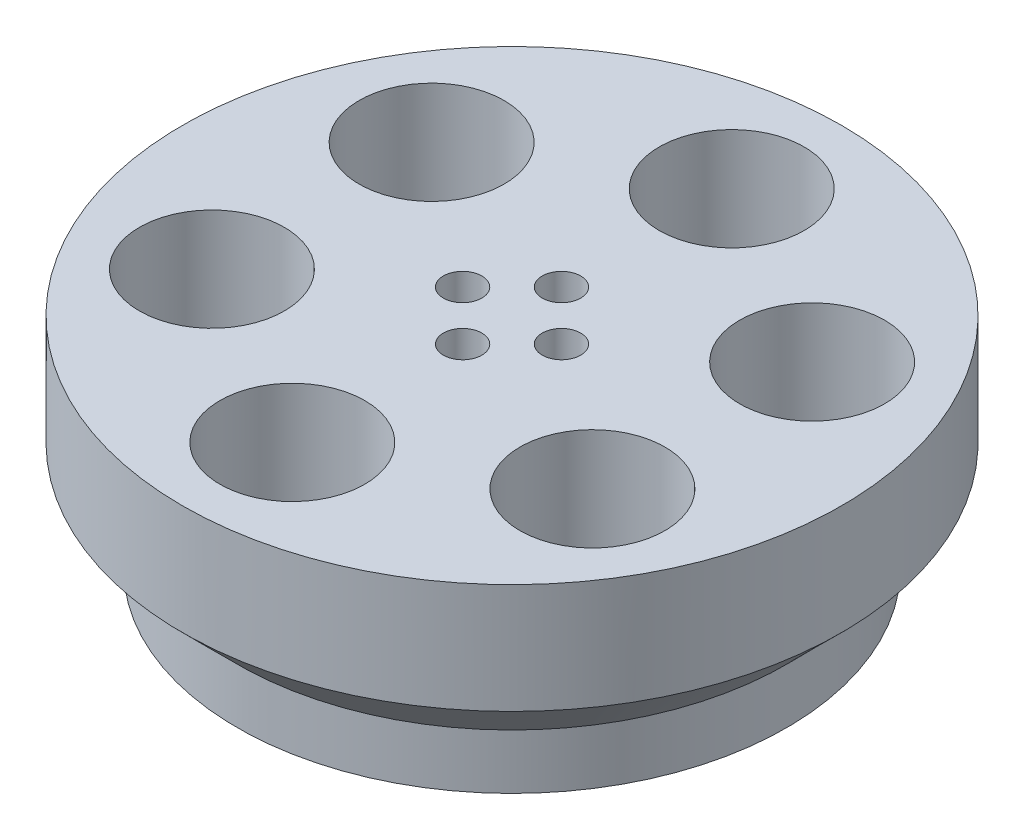
ISO-10303-21;
HEADER;
FILE_DESCRIPTION(('STEP AP214'),'2;1');
FILE_NAME('part.step','',(''),(''),'','','');
FILE_SCHEMA(('AUTOMOTIVE_DESIGN { 1 0 10303 214 1 1 1 1 }'));
ENDSEC;
DATA;
#1=APPLICATION_CONTEXT('core data for automotive mechanical design processes');
#2=APPLICATION_PROTOCOL_DEFINITION('international standard','automotive_design',2000,#1);
#3=PRODUCT_CONTEXT('',#1,'mechanical');
#4=PRODUCT('Part','Part','',(#3));
#5=PRODUCT_RELATED_PRODUCT_CATEGORY('part','',(#4));
#6=PRODUCT_DEFINITION_FORMATION('','',#4);
#7=PRODUCT_DEFINITION_CONTEXT('part definition',#1,'design');
#8=PRODUCT_DEFINITION('design','',#6,#7);
#9=PRODUCT_DEFINITION_SHAPE('','',#8);
#10=(LENGTH_UNIT() NAMED_UNIT(*) SI_UNIT(.MILLI.,.METRE.));
#11=(NAMED_UNIT(*) PLANE_ANGLE_UNIT() SI_UNIT($,.RADIAN.));
#12=(NAMED_UNIT(*) SI_UNIT($,.STERADIAN.) SOLID_ANGLE_UNIT());
#13=UNCERTAINTY_MEASURE_WITH_UNIT(LENGTH_MEASURE(1.E-05),#10,'distance_accuracy_value','');
#14=(GEOMETRIC_REPRESENTATION_CONTEXT(3) GLOBAL_UNCERTAINTY_ASSIGNED_CONTEXT((#13)) GLOBAL_UNIT_ASSIGNED_CONTEXT((#10,
#11,#12)) REPRESENTATION_CONTEXT('',''));
#15=CARTESIAN_POINT('',(0.,0.,0.));
#16=DIRECTION('',(0.,0.,1.));
#17=DIRECTION('',(1.,0.,0.));
#18=AXIS2_PLACEMENT_3D('',#15,#16,#17);
#19=CARTESIAN_POINT('',(0.,20.,0.));
#20=DIRECTION('',(0.,-1.,0.));
#21=DIRECTION('',(0.,0.,-1.));
#22=AXIS2_PLACEMENT_3D('',#19,#20,#21);
#23=CYLINDRICAL_SURFACE('',#22,30.);
#24=CARTESIAN_POINT('',(0.,20.,0.));
#25=DIRECTION('',(0.,1.,0.));
#26=DIRECTION('',(0.,0.,1.));
#27=AXIS2_PLACEMENT_3D('',#24,#25,#26);
#28=CIRCLE('',#27,30.);
#29=CARTESIAN_POINT('',(0.,20.,30.));
#30=VERTEX_POINT('',#29);
#31=EDGE_CURVE('E10',#30,#30,#28,.T.);
#32=ORIENTED_EDGE('',*,*,#31,.F.);
#33=EDGE_LOOP('',(#32));
#34=FACE_BOUND('',#33,.T.);
#35=CARTESIAN_POINT('',(0.,10.,0.));
#36=DIRECTION('',(0.,-1.,0.));
#37=DIRECTION('',(0.,0.,-1.));
#38=AXIS2_PLACEMENT_3D('',#35,#36,#37);
#39=CIRCLE('',#38,30.);
#40=CARTESIAN_POINT('',(0.,10.,-30.));
#41=VERTEX_POINT('',#40);
#42=EDGE_CURVE('E166',#41,#41,#39,.T.);
#43=ORIENTED_EDGE('',*,*,#42,.F.);
#44=EDGE_LOOP('',(#43));
#45=FACE_BOUND('',#44,.T.);
#46=ADVANCED_FACE('F31',(#34,#45),#23,.T.);
#47=CARTESIAN_POINT('',(0.,0.,0.));
#48=DIRECTION('',(0.,1.,0.));
#49=DIRECTION('',(0.,0.,1.));
#50=AXIS2_PLACEMENT_3D('',#47,#48,#49);
#51=PLANE('',#50);
#52=CARTESIAN_POINT('',(0.,0.,-20.));
#53=DIRECTION('',(0.,1.,0.));
#54=DIRECTION('',(0.,0.,1.));
#55=AXIS2_PLACEMENT_3D('',#52,#53,#54);
#56=CIRCLE('',#55,2.);
#57=CARTESIAN_POINT('',(0.,0.,-18.));
#58=VERTEX_POINT('',#57);
#59=EDGE_CURVE('E135',#58,#58,#56,.T.);
#60=ORIENTED_EDGE('',*,*,#59,.T.);
#61=EDGE_LOOP('',(#60));
#62=FACE_BOUND('',#61,.T.);
#63=CARTESIAN_POINT('',(-17.3205080756888,0.,-9.99999999999996));
#64=DIRECTION('',(0.,1.,0.));
#65=DIRECTION('',(0.,0.,1.));
#66=AXIS2_PLACEMENT_3D('',#63,#64,#65);
#67=CIRCLE('',#66,2.);
#68=CARTESIAN_POINT('',(-17.3205080756888,0.,-7.99999999999996));
#69=VERTEX_POINT('',#68);
#70=EDGE_CURVE('E99',#69,#69,#67,.T.);
#71=ORIENTED_EDGE('',*,*,#70,.T.);
#72=EDGE_LOOP('',(#71));
#73=FACE_BOUND('',#72,.T.);
#74=CARTESIAN_POINT('',(-17.3205080756887,0.,10.0000000000001));
#75=DIRECTION('',(0.,1.,0.));
#76=DIRECTION('',(0.,0.,1.));
#77=AXIS2_PLACEMENT_3D('',#74,#75,#76);
#78=CIRCLE('',#77,2.);
#79=CARTESIAN_POINT('',(-17.3205080756887,0.,12.0000000000001));
#80=VERTEX_POINT('',#79);
#81=EDGE_CURVE('E93',#80,#80,#78,.T.);
#82=ORIENTED_EDGE('',*,*,#81,.T.);
#83=EDGE_LOOP('',(#82));
#84=FACE_BOUND('',#83,.T.);
#85=CARTESIAN_POINT('',(0.,0.,20.));
#86=DIRECTION('',(0.,1.,0.));
#87=DIRECTION('',(0.,0.,1.));
#88=AXIS2_PLACEMENT_3D('',#85,#86,#87);
#89=CIRCLE('',#88,2.);
#90=CARTESIAN_POINT('',(0.,0.,22.));
#91=VERTEX_POINT('',#90);
#92=EDGE_CURVE('E87',#91,#91,#89,.T.);
#93=ORIENTED_EDGE('',*,*,#92,.T.);
#94=EDGE_LOOP('',(#93));
#95=FACE_BOUND('',#94,.T.);
#96=CARTESIAN_POINT('',(17.3205080756889,0.,9.99999999999984));
#97=DIRECTION('',(0.,1.,0.));
#98=DIRECTION('',(0.,0.,1.));
#99=AXIS2_PLACEMENT_3D('',#96,#97,#98);
#100=CIRCLE('',#99,2.);
#101=CARTESIAN_POINT('',(17.3205080756889,0.,11.9999999999998));
#102=VERTEX_POINT('',#101);
#103=EDGE_CURVE('E81',#102,#102,#100,.T.);
#104=ORIENTED_EDGE('',*,*,#103,.T.);
#105=EDGE_LOOP('',(#104));
#106=FACE_BOUND('',#105,.T.);
#107=CARTESIAN_POINT('',(17.3205080756887,0.,-10.0000000000002));
#108=DIRECTION('',(0.,1.,0.));
#109=DIRECTION('',(0.,0.,1.));
#110=AXIS2_PLACEMENT_3D('',#107,#108,#109);
#111=CIRCLE('',#110,2.);
#112=CARTESIAN_POINT('',(17.3205080756887,0.,-8.0000000000002));
#113=VERTEX_POINT('',#112);
#114=EDGE_CURVE('E75',#113,#113,#111,.T.);
#115=ORIENTED_EDGE('',*,*,#114,.T.);
#116=EDGE_LOOP('',(#115));
#117=FACE_BOUND('',#116,.T.);
#118=CARTESIAN_POINT('',(4.5,0.,0.));
#119=DIRECTION('',(0.,1.,0.));
#120=DIRECTION('',(0.,0.,1.));
#121=AXIS2_PLACEMENT_3D('',#118,#119,#120);
#122=CIRCLE('',#121,1.75);
#123=CARTESIAN_POINT('',(4.5,0.,1.75));
#124=VERTEX_POINT('',#123);
#125=EDGE_CURVE('E47',#124,#124,#122,.T.);
#126=ORIENTED_EDGE('',*,*,#125,.T.);
#127=EDGE_LOOP('',(#126));
#128=FACE_BOUND('',#127,.T.);
#129=CARTESIAN_POINT('',(0.,0.,-4.5));
#130=DIRECTION('',(0.,1.,0.));
#131=DIRECTION('',(0.,0.,1.));
#132=AXIS2_PLACEMENT_3D('',#129,#130,#131);
#133=CIRCLE('',#132,1.75);
#134=CARTESIAN_POINT('',(0.,0.,-2.75));
#135=VERTEX_POINT('',#134);
#136=EDGE_CURVE('E52',#135,#135,#133,.T.);
#137=ORIENTED_EDGE('',*,*,#136,.T.);
#138=EDGE_LOOP('',(#137));
#139=FACE_BOUND('',#138,.T.);
#140=CARTESIAN_POINT('',(-4.5,0.,0.));
#141=DIRECTION('',(0.,1.,0.));
#142=DIRECTION('',(0.,0.,1.));
#143=AXIS2_PLACEMENT_3D('',#140,#141,#142);
#144=CIRCLE('',#143,1.75);
#145=CARTESIAN_POINT('',(-4.5,0.,1.75));
#146=VERTEX_POINT('',#145);
#147=EDGE_CURVE('E55',#146,#146,#144,.T.);
#148=ORIENTED_EDGE('',*,*,#147,.T.);
#149=EDGE_LOOP('',(#148));
#150=FACE_BOUND('',#149,.T.);
#151=CARTESIAN_POINT('',(0.,0.,4.5));
#152=DIRECTION('',(0.,1.,0.));
#153=DIRECTION('',(0.,0.,1.));
#154=AXIS2_PLACEMENT_3D('',#151,#152,#153);
#155=CIRCLE('',#154,1.75);
#156=CARTESIAN_POINT('',(0.,0.,6.25));
#157=VERTEX_POINT('',#156);
#158=EDGE_CURVE('E34',#157,#157,#155,.T.);
#159=ORIENTED_EDGE('',*,*,#158,.T.);
#160=EDGE_LOOP('',(#159));
#161=FACE_BOUND('',#160,.T.);
#162=CARTESIAN_POINT('',(0.,0.,0.));
#163=DIRECTION('',(0.,-1.,0.));
#164=DIRECTION('',(0.,0.,-1.));
#165=AXIS2_PLACEMENT_3D('',#162,#163,#164);
#166=CIRCLE('',#165,25.);
#167=CARTESIAN_POINT('',(0.,0.,-25.));
#168=VERTEX_POINT('',#167);
#169=EDGE_CURVE('E171',#168,#168,#166,.T.);
#170=ORIENTED_EDGE('',*,*,#169,.T.);
#171=EDGE_LOOP('',(#170));
#172=FACE_BOUND('',#171,.T.);
#173=ADVANCED_FACE('F146',(#62,#73,#84,#95,#106,#117,#128,#139,#150,#161,#172),#51,.F.);
#174=CARTESIAN_POINT('',(0.,20.,0.));
#175=DIRECTION('',(0.,1.,0.));
#176=DIRECTION('',(0.,0.,1.));
#177=AXIS2_PLACEMENT_3D('',#174,#175,#176);
#178=PLANE('',#177);
#179=CARTESIAN_POINT('',(0.,20.,4.5));
#180=DIRECTION('',(0.,1.,0.));
#181=DIRECTION('',(-1.,0.,0.));
#182=AXIS2_PLACEMENT_3D('',#179,#180,#181);
#183=CIRCLE('',#182,1.75);
#184=CARTESIAN_POINT('',(0.,20.,6.25));
#185=VERTEX_POINT('',#184);
#186=EDGE_CURVE('E67',#185,#185,#183,.T.);
#187=ORIENTED_EDGE('',*,*,#186,.F.);
#188=EDGE_LOOP('',(#187));
#189=FACE_BOUND('',#188,.T.);
#190=CARTESIAN_POINT('',(-4.5,20.,0.));
#191=DIRECTION('',(0.,1.,0.));
#192=DIRECTION('',(0.,0.,-1.));
#193=AXIS2_PLACEMENT_3D('',#190,#191,#192);
#194=CIRCLE('',#193,1.75);
#195=CARTESIAN_POINT('',(-4.5,20.,1.75));
#196=VERTEX_POINT('',#195);
#197=EDGE_CURVE('E57',#196,#196,#194,.T.);
#198=ORIENTED_EDGE('',*,*,#197,.F.);
#199=EDGE_LOOP('',(#198));
#200=FACE_BOUND('',#199,.T.);
#201=CARTESIAN_POINT('',(0.,20.,-4.5));
#202=DIRECTION('',(0.,1.,0.));
#203=DIRECTION('',(1.,0.,0.));
#204=AXIS2_PLACEMENT_3D('',#201,#202,#203);
#205=CIRCLE('',#204,1.75);
#206=CARTESIAN_POINT('',(0.,20.,-2.75));
#207=VERTEX_POINT('',#206);
#208=EDGE_CURVE('E54',#207,#207,#205,.T.);
#209=ORIENTED_EDGE('',*,*,#208,.F.);
#210=EDGE_LOOP('',(#209));
#211=FACE_BOUND('',#210,.T.);
#212=CARTESIAN_POINT('',(4.5,20.,0.));
#213=DIRECTION('',(0.,1.,0.));
#214=DIRECTION('',(0.,0.,1.));
#215=AXIS2_PLACEMENT_3D('',#212,#213,#214);
#216=CIRCLE('',#215,1.75);
#217=CARTESIAN_POINT('',(4.5,20.,1.75));
#218=VERTEX_POINT('',#217);
#219=EDGE_CURVE('E51',#218,#218,#216,.T.);
#220=ORIENTED_EDGE('',*,*,#219,.F.);
#221=EDGE_LOOP('',(#220));
#222=FACE_BOUND('',#221,.T.);
#223=CARTESIAN_POINT('',(17.3205080756887,20.,-10.0000000000002));
#224=DIRECTION('',(0.,1.,0.));
#225=DIRECTION('',(-0.866025403784433,0.,0.50000000000001));
#226=AXIS2_PLACEMENT_3D('',#223,#224,#225);
#227=CIRCLE('',#226,6.6);
#228=CARTESIAN_POINT('',(11.6047404107114,20.,-6.70000000000013));
#229=VERTEX_POINT('',#228);
#230=EDGE_CURVE('E102',#229,#229,#227,.T.);
#231=ORIENTED_EDGE('',*,*,#230,.F.);
#232=EDGE_LOOP('',(#231));
#233=FACE_BOUND('',#232,.T.);
#234=CARTESIAN_POINT('',(17.3205080756889,20.,9.99999999999984));
#235=DIRECTION('',(0.,1.,0.));
#236=DIRECTION('',(-0.866025403784443,0.,-0.499999999999992));
#237=AXIS2_PLACEMENT_3D('',#234,#235,#236);
#238=CIRCLE('',#237,6.6);
#239=CARTESIAN_POINT('',(11.6047404107115,20.,6.69999999999989));
#240=VERTEX_POINT('',#239);
#241=EDGE_CURVE('E106',#240,#240,#238,.T.);
#242=ORIENTED_EDGE('',*,*,#241,.F.);
#243=EDGE_LOOP('',(#242));
#244=FACE_BOUND('',#243,.T.);
#245=CARTESIAN_POINT('',(0.,20.,20.));
#246=DIRECTION('',(0.,1.,0.));
#247=DIRECTION('',(0.,0.,-1.));
#248=AXIS2_PLACEMENT_3D('',#245,#246,#247);
#249=CIRCLE('',#248,6.6);
#250=CARTESIAN_POINT('',(0.,20.,13.4));
#251=VERTEX_POINT('',#250);
#252=EDGE_CURVE('E112',#251,#251,#249,.T.);
#253=ORIENTED_EDGE('',*,*,#252,.F.);
#254=EDGE_LOOP('',(#253));
#255=FACE_BOUND('',#254,.T.);
#256=CARTESIAN_POINT('',(-17.3205080756887,20.,10.0000000000001));
#257=DIRECTION('',(0.,1.,0.));
#258=DIRECTION('',(0.866025403784436,0.,-0.500000000000004));
#259=AXIS2_PLACEMENT_3D('',#256,#257,#258);
#260=CIRCLE('',#259,6.6);
#261=CARTESIAN_POINT('',(-11.6047404107115,20.,6.70000000000005));
#262=VERTEX_POINT('',#261);
#263=EDGE_CURVE('E118',#262,#262,#260,.T.);
#264=ORIENTED_EDGE('',*,*,#263,.F.);
#265=EDGE_LOOP('',(#264));
#266=FACE_BOUND('',#265,.T.);
#267=CARTESIAN_POINT('',(-17.3205080756888,20.,-9.99999999999996));
#268=DIRECTION('',(0.,1.,0.));
#269=DIRECTION('',(0.86602540378444,0.,0.499999999999998));
#270=AXIS2_PLACEMENT_3D('',#267,#268,#269);
#271=CIRCLE('',#270,6.6);
#272=CARTESIAN_POINT('',(-11.6047404107115,20.,-6.69999999999997));
#273=VERTEX_POINT('',#272);
#274=EDGE_CURVE('E124',#273,#273,#271,.T.);
#275=ORIENTED_EDGE('',*,*,#274,.F.);
#276=EDGE_LOOP('',(#275));
#277=FACE_BOUND('',#276,.T.);
#278=CARTESIAN_POINT('',(0.,20.,-20.));
#279=DIRECTION('',(0.,1.,0.));
#280=DIRECTION('',(0.,0.,1.));
#281=AXIS2_PLACEMENT_3D('',#278,#279,#280);
#282=CIRCLE('',#281,6.6);
#283=CARTESIAN_POINT('',(0.,20.,-13.4));
#284=VERTEX_POINT('',#283);
#285=EDGE_CURVE('E43',#284,#284,#282,.T.);
#286=ORIENTED_EDGE('',*,*,#285,.F.);
#287=EDGE_LOOP('',(#286));
#288=FACE_BOUND('',#287,.T.);
#289=ORIENTED_EDGE('',*,*,#31,.T.);
#290=EDGE_LOOP('',(#289));
#291=FACE_BOUND('',#290,.T.);
#292=ADVANCED_FACE('F144',(#189,#200,#211,#222,#233,#244,#255,#266,#277,#288,#291),#178,.T.);
#293=CARTESIAN_POINT('',(0.,10.,-20.));
#294=DIRECTION('',(0.,1.,0.));
#295=DIRECTION('',(0.,0.,1.));
#296=AXIS2_PLACEMENT_3D('',#293,#294,#295);
#297=CYLINDRICAL_SURFACE('',#296,6.6);
#298=CARTESIAN_POINT('',(0.,10.,-20.));
#299=DIRECTION('',(0.,1.,0.));
#300=DIRECTION('',(0.,0.,1.));
#301=AXIS2_PLACEMENT_3D('',#298,#299,#300);
#302=CIRCLE('',#301,6.6);
#303=CARTESIAN_POINT('',(0.,10.,-13.4));
#304=VERTEX_POINT('',#303);
#305=EDGE_CURVE('E38',#304,#304,#302,.T.);
#306=ORIENTED_EDGE('',*,*,#305,.F.);
#307=EDGE_LOOP('',(#306));
#308=FACE_BOUND('',#307,.T.);
#309=ORIENTED_EDGE('',*,*,#285,.T.);
#310=EDGE_LOOP('',(#309));
#311=FACE_BOUND('',#310,.T.);
#312=ADVANCED_FACE('F142',(#308,#311),#297,.F.);
#313=CARTESIAN_POINT('',(0.,10.,-20.));
#314=DIRECTION('',(0.,1.,0.));
#315=DIRECTION('',(0.,0.,1.));
#316=AXIS2_PLACEMENT_3D('',#313,#314,#315);
#317=PLANE('',#316);
#318=CARTESIAN_POINT('',(0.,10.,-20.));
#319=DIRECTION('',(0.,1.,0.));
#320=DIRECTION('',(0.,0.,1.));
#321=AXIS2_PLACEMENT_3D('',#318,#319,#320);
#322=CIRCLE('',#321,2.);
#323=CARTESIAN_POINT('',(0.,10.,-18.));
#324=VERTEX_POINT('',#323);
#325=EDGE_CURVE('E130',#324,#324,#322,.T.);
#326=ORIENTED_EDGE('',*,*,#325,.F.);
#327=EDGE_LOOP('',(#326));
#328=FACE_BOUND('',#327,.T.);
#329=ORIENTED_EDGE('',*,*,#305,.T.);
#330=EDGE_LOOP('',(#329));
#331=FACE_BOUND('',#330,.T.);
#332=ADVANCED_FACE('F152',(#328,#331),#317,.T.);
#333=CARTESIAN_POINT('',(0.,-25.,-20.));
#334=DIRECTION('',(0.,1.,0.));
#335=DIRECTION('',(0.,0.,1.));
#336=AXIS2_PLACEMENT_3D('',#333,#334,#335);
#337=CYLINDRICAL_SURFACE('',#336,2.);
#338=ORIENTED_EDGE('',*,*,#325,.T.);
#339=EDGE_LOOP('',(#338));
#340=FACE_BOUND('',#339,.T.);
#341=ORIENTED_EDGE('',*,*,#59,.F.);
#342=EDGE_LOOP('',(#341));
#343=FACE_BOUND('',#342,.T.);
#344=ADVANCED_FACE('F262',(#340,#343),#337,.F.);
#345=CARTESIAN_POINT('',(-17.3205080756888,10.,-9.99999999999996));
#346=DIRECTION('',(0.,1.,0.));
#347=DIRECTION('',(0.,0.,1.));
#348=AXIS2_PLACEMENT_3D('',#345,#346,#347);
#349=CYLINDRICAL_SURFACE('',#348,6.6);
#350=CARTESIAN_POINT('',(-17.3205080756888,10.,-9.99999999999996));
#351=DIRECTION('',(0.,1.,0.));
#352=DIRECTION('',(0.86602540378444,0.,0.499999999999998));
#353=AXIS2_PLACEMENT_3D('',#350,#351,#352);
#354=CIRCLE('',#353,6.6);
#355=CARTESIAN_POINT('',(-11.6047404107115,10.,-6.69999999999997));
#356=VERTEX_POINT('',#355);
#357=EDGE_CURVE('E127',#356,#356,#354,.T.);
#358=ORIENTED_EDGE('',*,*,#357,.F.);
#359=EDGE_LOOP('',(#358));
#360=FACE_BOUND('',#359,.T.);
#361=ORIENTED_EDGE('',*,*,#274,.T.);
#362=EDGE_LOOP('',(#361));
#363=FACE_BOUND('',#362,.T.);
#364=ADVANCED_FACE('F258',(#360,#363),#349,.F.);
#365=CARTESIAN_POINT('',(-17.3205080756888,10.,-9.99999999999996));
#366=DIRECTION('',(0.,1.,0.));
#367=DIRECTION('',(0.86602540378444,0.,0.499999999999998));
#368=AXIS2_PLACEMENT_3D('',#365,#366,#367);
#369=PLANE('',#368);
#370=CARTESIAN_POINT('',(-17.3205080756888,10.,-9.99999999999996));
#371=DIRECTION('',(0.,1.,0.));
#372=DIRECTION('',(0.86602540378444,0.,0.499999999999998));
#373=AXIS2_PLACEMENT_3D('',#370,#371,#372);
#374=CIRCLE('',#373,2.);
#375=CARTESIAN_POINT('',(-15.5884572681199,10.,-8.99999999999996));
#376=VERTEX_POINT('',#375);
#377=EDGE_CURVE('E96',#376,#376,#374,.T.);
#378=ORIENTED_EDGE('',*,*,#377,.F.);
#379=EDGE_LOOP('',(#378));
#380=FACE_BOUND('',#379,.T.);
#381=ORIENTED_EDGE('',*,*,#357,.T.);
#382=EDGE_LOOP('',(#381));
#383=FACE_BOUND('',#382,.T.);
#384=ADVANCED_FACE('F254',(#380,#383),#369,.T.);
#385=CARTESIAN_POINT('',(-17.3205080756887,10.,10.0000000000001));
#386=DIRECTION('',(0.,1.,0.));
#387=DIRECTION('',(0.,0.,1.));
#388=AXIS2_PLACEMENT_3D('',#385,#386,#387);
#389=CYLINDRICAL_SURFACE('',#388,6.6);
#390=CARTESIAN_POINT('',(-17.3205080756887,10.,10.0000000000001));
#391=DIRECTION('',(0.,1.,0.));
#392=DIRECTION('',(0.866025403784436,0.,-0.500000000000004));
#393=AXIS2_PLACEMENT_3D('',#390,#391,#392);
#394=CIRCLE('',#393,6.6);
#395=CARTESIAN_POINT('',(-11.6047404107115,10.,6.70000000000005));
#396=VERTEX_POINT('',#395);
#397=EDGE_CURVE('E121',#396,#396,#394,.T.);
#398=ORIENTED_EDGE('',*,*,#397,.F.);
#399=EDGE_LOOP('',(#398));
#400=FACE_BOUND('',#399,.T.);
#401=ORIENTED_EDGE('',*,*,#263,.T.);
#402=EDGE_LOOP('',(#401));
#403=FACE_BOUND('',#402,.T.);
#404=ADVANCED_FACE('F250',(#400,#403),#389,.F.);
#405=CARTESIAN_POINT('',(-17.3205080756887,10.,10.0000000000001));
#406=DIRECTION('',(0.,1.,0.));
#407=DIRECTION('',(0.866025403784436,0.,-0.500000000000004));
#408=AXIS2_PLACEMENT_3D('',#405,#406,#407);
#409=PLANE('',#408);
#410=CARTESIAN_POINT('',(-17.3205080756887,10.,10.0000000000001));
#411=DIRECTION('',(0.,1.,0.));
#412=DIRECTION('',(0.866025403784436,0.,-0.500000000000004));
#413=AXIS2_PLACEMENT_3D('',#410,#411,#412);
#414=CIRCLE('',#413,2.);
#415=CARTESIAN_POINT('',(-15.5884572681199,10.,9.00000000000007));
#416=VERTEX_POINT('',#415);
#417=EDGE_CURVE('E90',#416,#416,#414,.T.);
#418=ORIENTED_EDGE('',*,*,#417,.F.);
#419=EDGE_LOOP('',(#418));
#420=FACE_BOUND('',#419,.T.);
#421=ORIENTED_EDGE('',*,*,#397,.T.);
#422=EDGE_LOOP('',(#421));
#423=FACE_BOUND('',#422,.T.);
#424=ADVANCED_FACE('F246',(#420,#423),#409,.T.);
#425=CARTESIAN_POINT('',(0.,10.,20.));
#426=DIRECTION('',(0.,1.,0.));
#427=DIRECTION('',(0.,0.,1.));
#428=AXIS2_PLACEMENT_3D('',#425,#426,#427);
#429=CYLINDRICAL_SURFACE('',#428,6.6);
#430=CARTESIAN_POINT('',(0.,10.,20.));
#431=DIRECTION('',(0.,1.,0.));
#432=DIRECTION('',(0.,0.,-1.));
#433=AXIS2_PLACEMENT_3D('',#430,#431,#432);
#434=CIRCLE('',#433,6.6);
#435=CARTESIAN_POINT('',(0.,10.,13.4));
#436=VERTEX_POINT('',#435);
#437=EDGE_CURVE('E115',#436,#436,#434,.T.);
#438=ORIENTED_EDGE('',*,*,#437,.F.);
#439=EDGE_LOOP('',(#438));
#440=FACE_BOUND('',#439,.T.);
#441=ORIENTED_EDGE('',*,*,#252,.T.);
#442=EDGE_LOOP('',(#441));
#443=FACE_BOUND('',#442,.T.);
#444=ADVANCED_FACE('F242',(#440,#443),#429,.F.);
#445=CARTESIAN_POINT('',(0.,10.,20.));
#446=DIRECTION('',(0.,1.,0.));
#447=DIRECTION('',(0.,0.,-1.));
#448=AXIS2_PLACEMENT_3D('',#445,#446,#447);
#449=PLANE('',#448);
#450=CARTESIAN_POINT('',(0.,10.,20.));
#451=DIRECTION('',(0.,1.,0.));
#452=DIRECTION('',(0.,0.,-1.));
#453=AXIS2_PLACEMENT_3D('',#450,#451,#452);
#454=CIRCLE('',#453,2.);
#455=CARTESIAN_POINT('',(0.,10.,18.));
#456=VERTEX_POINT('',#455);
#457=EDGE_CURVE('E84',#456,#456,#454,.T.);
#458=ORIENTED_EDGE('',*,*,#457,.F.);
#459=EDGE_LOOP('',(#458));
#460=FACE_BOUND('',#459,.T.);
#461=ORIENTED_EDGE('',*,*,#437,.T.);
#462=EDGE_LOOP('',(#461));
#463=FACE_BOUND('',#462,.T.);
#464=ADVANCED_FACE('F238',(#460,#463),#449,.T.);
#465=CARTESIAN_POINT('',(17.3205080756889,10.,9.99999999999984));
#466=DIRECTION('',(0.,1.,0.));
#467=DIRECTION('',(0.,0.,1.));
#468=AXIS2_PLACEMENT_3D('',#465,#466,#467);
#469=CYLINDRICAL_SURFACE('',#468,6.6);
#470=CARTESIAN_POINT('',(17.3205080756889,10.,9.99999999999984));
#471=DIRECTION('',(0.,1.,0.));
#472=DIRECTION('',(-0.866025403784443,0.,-0.499999999999992));
#473=AXIS2_PLACEMENT_3D('',#470,#471,#472);
#474=CIRCLE('',#473,6.6);
#475=CARTESIAN_POINT('',(11.6047404107115,10.,6.69999999999989));
#476=VERTEX_POINT('',#475);
#477=EDGE_CURVE('E109',#476,#476,#474,.T.);
#478=ORIENTED_EDGE('',*,*,#477,.F.);
#479=EDGE_LOOP('',(#478));
#480=FACE_BOUND('',#479,.T.);
#481=ORIENTED_EDGE('',*,*,#241,.T.);
#482=EDGE_LOOP('',(#481));
#483=FACE_BOUND('',#482,.T.);
#484=ADVANCED_FACE('F234',(#480,#483),#469,.F.);
#485=CARTESIAN_POINT('',(17.3205080756889,10.,9.99999999999984));
#486=DIRECTION('',(0.,1.,0.));
#487=DIRECTION('',(-0.866025403784443,0.,-0.499999999999992));
#488=AXIS2_PLACEMENT_3D('',#485,#486,#487);
#489=PLANE('',#488);
#490=CARTESIAN_POINT('',(17.3205080756889,10.,9.99999999999984));
#491=DIRECTION('',(0.,1.,0.));
#492=DIRECTION('',(-0.866025403784443,0.,-0.499999999999992));
#493=AXIS2_PLACEMENT_3D('',#490,#491,#492);
#494=CIRCLE('',#493,2.);
#495=CARTESIAN_POINT('',(15.58845726812,10.,8.99999999999985));
#496=VERTEX_POINT('',#495);
#497=EDGE_CURVE('E78',#496,#496,#494,.T.);
#498=ORIENTED_EDGE('',*,*,#497,.F.);
#499=EDGE_LOOP('',(#498));
#500=FACE_BOUND('',#499,.T.);
#501=ORIENTED_EDGE('',*,*,#477,.T.);
#502=EDGE_LOOP('',(#501));
#503=FACE_BOUND('',#502,.T.);
#504=ADVANCED_FACE('F230',(#500,#503),#489,.T.);
#505=CARTESIAN_POINT('',(17.3205080756887,10.,-10.0000000000002));
#506=DIRECTION('',(0.,1.,0.));
#507=DIRECTION('',(0.,0.,1.));
#508=AXIS2_PLACEMENT_3D('',#505,#506,#507);
#509=CYLINDRICAL_SURFACE('',#508,6.6);
#510=CARTESIAN_POINT('',(17.3205080756887,10.,-10.0000000000002));
#511=DIRECTION('',(0.,1.,0.));
#512=DIRECTION('',(-0.866025403784433,0.,0.50000000000001));
#513=AXIS2_PLACEMENT_3D('',#510,#511,#512);
#514=CIRCLE('',#513,6.6);
#515=CARTESIAN_POINT('',(11.6047404107114,10.,-6.70000000000013));
#516=VERTEX_POINT('',#515);
#517=EDGE_CURVE('E103',#516,#516,#514,.T.);
#518=ORIENTED_EDGE('',*,*,#517,.F.);
#519=EDGE_LOOP('',(#518));
#520=FACE_BOUND('',#519,.T.);
#521=ORIENTED_EDGE('',*,*,#230,.T.);
#522=EDGE_LOOP('',(#521));
#523=FACE_BOUND('',#522,.T.);
#524=ADVANCED_FACE('F226',(#520,#523),#509,.F.);
#525=CARTESIAN_POINT('',(17.3205080756887,10.,-10.0000000000002));
#526=DIRECTION('',(0.,1.,0.));
#527=DIRECTION('',(-0.866025403784433,0.,0.50000000000001));
#528=AXIS2_PLACEMENT_3D('',#525,#526,#527);
#529=PLANE('',#528);
#530=CARTESIAN_POINT('',(17.3205080756887,10.,-10.0000000000002));
#531=DIRECTION('',(0.,1.,0.));
#532=DIRECTION('',(-0.866025403784433,0.,0.50000000000001));
#533=AXIS2_PLACEMENT_3D('',#530,#531,#532);
#534=CIRCLE('',#533,2.);
#535=CARTESIAN_POINT('',(15.5884572681198,10.,-9.00000000000018));
#536=VERTEX_POINT('',#535);
#537=EDGE_CURVE('E50',#536,#536,#534,.T.);
#538=ORIENTED_EDGE('',*,*,#537,.F.);
#539=EDGE_LOOP('',(#538));
#540=FACE_BOUND('',#539,.T.);
#541=ORIENTED_EDGE('',*,*,#517,.T.);
#542=EDGE_LOOP('',(#541));
#543=FACE_BOUND('',#542,.T.);
#544=ADVANCED_FACE('F222',(#540,#543),#529,.T.);
#545=CARTESIAN_POINT('',(-17.3205080756888,-25.,-9.99999999999996));
#546=DIRECTION('',(0.,1.,0.));
#547=DIRECTION('',(0.,0.,1.));
#548=AXIS2_PLACEMENT_3D('',#545,#546,#547);
#549=CYLINDRICAL_SURFACE('',#548,2.);
#550=ORIENTED_EDGE('',*,*,#377,.T.);
#551=EDGE_LOOP('',(#550));
#552=FACE_BOUND('',#551,.T.);
#553=ORIENTED_EDGE('',*,*,#70,.F.);
#554=EDGE_LOOP('',(#553));
#555=FACE_BOUND('',#554,.T.);
#556=ADVANCED_FACE('F218',(#552,#555),#549,.F.);
#557=CARTESIAN_POINT('',(-17.3205080756887,-25.,10.0000000000001));
#558=DIRECTION('',(0.,1.,0.));
#559=DIRECTION('',(0.,0.,1.));
#560=AXIS2_PLACEMENT_3D('',#557,#558,#559);
#561=CYLINDRICAL_SURFACE('',#560,2.);
#562=ORIENTED_EDGE('',*,*,#417,.T.);
#563=EDGE_LOOP('',(#562));
#564=FACE_BOUND('',#563,.T.);
#565=ORIENTED_EDGE('',*,*,#81,.F.);
#566=EDGE_LOOP('',(#565));
#567=FACE_BOUND('',#566,.T.);
#568=ADVANCED_FACE('F214',(#564,#567),#561,.F.);
#569=CARTESIAN_POINT('',(0.,-25.,20.));
#570=DIRECTION('',(0.,1.,0.));
#571=DIRECTION('',(0.,0.,1.));
#572=AXIS2_PLACEMENT_3D('',#569,#570,#571);
#573=CYLINDRICAL_SURFACE('',#572,2.);
#574=ORIENTED_EDGE('',*,*,#457,.T.);
#575=EDGE_LOOP('',(#574));
#576=FACE_BOUND('',#575,.T.);
#577=ORIENTED_EDGE('',*,*,#92,.F.);
#578=EDGE_LOOP('',(#577));
#579=FACE_BOUND('',#578,.T.);
#580=ADVANCED_FACE('F210',(#576,#579),#573,.F.);
#581=CARTESIAN_POINT('',(17.3205080756889,-25.,9.99999999999984));
#582=DIRECTION('',(0.,1.,0.));
#583=DIRECTION('',(0.,0.,1.));
#584=AXIS2_PLACEMENT_3D('',#581,#582,#583);
#585=CYLINDRICAL_SURFACE('',#584,2.);
#586=ORIENTED_EDGE('',*,*,#497,.T.);
#587=EDGE_LOOP('',(#586));
#588=FACE_BOUND('',#587,.T.);
#589=ORIENTED_EDGE('',*,*,#103,.F.);
#590=EDGE_LOOP('',(#589));
#591=FACE_BOUND('',#590,.T.);
#592=ADVANCED_FACE('F206',(#588,#591),#585,.F.);
#593=CARTESIAN_POINT('',(17.3205080756887,-25.,-10.0000000000002));
#594=DIRECTION('',(0.,1.,0.));
#595=DIRECTION('',(0.,0.,1.));
#596=AXIS2_PLACEMENT_3D('',#593,#594,#595);
#597=CYLINDRICAL_SURFACE('',#596,2.);
#598=ORIENTED_EDGE('',*,*,#537,.T.);
#599=EDGE_LOOP('',(#598));
#600=FACE_BOUND('',#599,.T.);
#601=ORIENTED_EDGE('',*,*,#114,.F.);
#602=EDGE_LOOP('',(#601));
#603=FACE_BOUND('',#602,.T.);
#604=ADVANCED_FACE('F202',(#600,#603),#597,.F.);
#605=CARTESIAN_POINT('',(4.5,-25.,0.));
#606=DIRECTION('',(0.,1.,0.));
#607=DIRECTION('',(0.,0.,1.));
#608=AXIS2_PLACEMENT_3D('',#605,#606,#607);
#609=CYLINDRICAL_SURFACE('',#608,1.75);
#610=CARTESIAN_POINT('',(4.5,20.,1.75));
#611=CARTESIAN_POINT('',(4.5,19.7916666666667,1.75));
#612=CARTESIAN_POINT('',(4.5,19.5833333333333,1.75));
#613=CARTESIAN_POINT('',(4.5,19.1666666666667,1.75));
#614=CARTESIAN_POINT('',(4.5,18.9583333333333,1.75));
#615=CARTESIAN_POINT('',(4.5,18.5416666666667,1.75));
#616=CARTESIAN_POINT('',(4.5,18.3333333333333,1.75));
#617=CARTESIAN_POINT('',(4.5,17.9166666666667,1.75));
#618=CARTESIAN_POINT('',(4.5,17.7083333333333,1.75));
#619=CARTESIAN_POINT('',(4.5,17.2916666666667,1.75));
#620=CARTESIAN_POINT('',(4.5,17.0833333333333,1.75));
#621=CARTESIAN_POINT('',(4.5,16.6666666666667,1.75));
#622=CARTESIAN_POINT('',(4.5,16.4583333333333,1.75));
#623=CARTESIAN_POINT('',(4.5,16.0416666666667,1.75));
#624=CARTESIAN_POINT('',(4.5,15.8333333333333,1.75));
#625=CARTESIAN_POINT('',(4.5,15.4166666666667,1.75));
#626=CARTESIAN_POINT('',(4.5,15.2083333333333,1.75));
#627=CARTESIAN_POINT('',(4.5,14.7916666666667,1.75));
#628=CARTESIAN_POINT('',(4.5,14.5833333333333,1.75));
#629=CARTESIAN_POINT('',(4.5,14.1666666666667,1.75));
#630=CARTESIAN_POINT('',(4.5,13.9583333333333,1.75));
#631=CARTESIAN_POINT('',(4.5,13.5416666666667,1.75));
#632=CARTESIAN_POINT('',(4.5,13.3333333333333,1.75));
#633=CARTESIAN_POINT('',(4.5,12.9166666666667,1.75));
#634=CARTESIAN_POINT('',(4.5,12.7083333333333,1.75));
#635=CARTESIAN_POINT('',(4.5,12.2916666666667,1.75));
#636=CARTESIAN_POINT('',(4.5,12.0833333333333,1.75));
#637=CARTESIAN_POINT('',(4.5,11.6666666666667,1.75));
#638=CARTESIAN_POINT('',(4.5,11.4583333333333,1.75));
#639=CARTESIAN_POINT('',(4.5,11.0416666666667,1.75));
#640=CARTESIAN_POINT('',(4.5,10.8333333333333,1.75));
#641=CARTESIAN_POINT('',(4.5,10.4166666666667,1.75));
#642=CARTESIAN_POINT('',(4.5,10.2083333333333,1.75));
#643=CARTESIAN_POINT('',(4.5,9.79166666666667,1.75));
#644=CARTESIAN_POINT('',(4.5,9.58333333333333,1.75));
#645=CARTESIAN_POINT('',(4.5,9.16666666666666,1.75));
#646=CARTESIAN_POINT('',(4.5,8.95833333333333,1.75));
#647=CARTESIAN_POINT('',(4.5,8.54166666666666,1.75));
#648=CARTESIAN_POINT('',(4.5,8.33333333333333,1.75));
#649=CARTESIAN_POINT('',(4.5,7.91666666666666,1.75));
#650=CARTESIAN_POINT('',(4.5,7.70833333333333,1.75));
#651=CARTESIAN_POINT('',(4.5,7.29166666666666,1.75));
#652=CARTESIAN_POINT('',(4.5,7.08333333333333,1.75));
#653=CARTESIAN_POINT('',(4.5,6.66666666666666,1.75));
#654=CARTESIAN_POINT('',(4.5,6.45833333333333,1.75));
#655=CARTESIAN_POINT('',(4.5,6.04166666666667,1.75));
#656=CARTESIAN_POINT('',(4.5,5.83333333333334,1.75));
#657=CARTESIAN_POINT('',(4.5,5.41666666666667,1.75));
#658=CARTESIAN_POINT('',(4.5,5.20833333333333,1.75));
#659=CARTESIAN_POINT('',(4.5,4.79166666666667,1.75));
#660=CARTESIAN_POINT('',(4.5,4.58333333333333,1.75));
#661=CARTESIAN_POINT('',(4.5,4.16666666666667,1.75));
#662=CARTESIAN_POINT('',(4.5,3.95833333333333,1.75));
#663=CARTESIAN_POINT('',(4.5,3.54166666666667,1.75));
#664=CARTESIAN_POINT('',(4.5,3.33333333333333,1.75));
#665=CARTESIAN_POINT('',(4.5,2.91666666666667,1.75));
#666=CARTESIAN_POINT('',(4.5,2.70833333333333,1.75));
#667=CARTESIAN_POINT('',(4.5,2.29166666666667,1.75));
#668=CARTESIAN_POINT('',(4.5,2.08333333333334,1.75));
#669=CARTESIAN_POINT('',(4.5,1.66666666666667,1.75));
#670=CARTESIAN_POINT('',(4.5,1.45833333333333,1.75));
#671=CARTESIAN_POINT('',(4.5,1.04166666666667,1.75));
#672=CARTESIAN_POINT('',(4.5,0.833333333333334,1.75));
#673=CARTESIAN_POINT('',(4.5,0.416666666666667,1.75));
#674=CARTESIAN_POINT('',(4.5,0.208333333333334,1.75));
#675=CARTESIAN_POINT('',(4.5,0.,1.75));
#676=B_SPLINE_CURVE_WITH_KNOTS('',3,(#610,#611,#612,#613,#614,#615,#616,#617,#618,#619,#620,
#621,#622,#623,#624,#625,#626,#627,#628,#629,#630,#631,#632,#633,#634,#635,#636,#637,#638,#639,
#640,#641,#642,#643,#644,#645,#646,#647,#648,#649,#650,#651,#652,#653,#654,#655,#656,#657,#658,
#659,#660,#661,#662,#663,#664,#665,#666,#667,#668,#669,#670,#671,#672,#673,#674,#675),
.UNSPECIFIED.,.F.,.F.,(4,2,2,2,2,2,2,2,2,2,2,2,2,2,2,2,2,2,2,2,2,2,2,2,2,2,2,2,2,2,2,2,4),(0.,
0.625000000000001,1.25,1.875,2.5,3.125,3.75,4.375,5.,5.62500000000001,6.25,6.875,7.5,8.125,8.75,
9.375,10.,10.625,11.25,11.875,12.5,13.125,13.75,14.375,15.,15.625,16.25,16.875,17.5,18.125,
18.75,19.375,20.),.UNSPECIFIED.);
#677=EDGE_CURVE('BSEAM198',#218,#124,#676,.T.);
#678=ORIENTED_EDGE('',*,*,#219,.T.);
#679=ORIENTED_EDGE('',*,*,#125,.F.);
#680=ORIENTED_EDGE('',*,*,#677,.T.);
#681=ORIENTED_EDGE('',*,*,#677,.F.);
#682=EDGE_LOOP('',(#678,#680,#679,#681));
#683=FACE_BOUND('',#682,.T.);
#684=ADVANCED_FACE('F198',(#683),#609,.F.);
#685=CARTESIAN_POINT('',(0.,-25.,-4.5));
#686=DIRECTION('',(0.,1.,0.));
#687=DIRECTION('',(0.,0.,1.));
#688=AXIS2_PLACEMENT_3D('',#685,#686,#687);
#689=CYLINDRICAL_SURFACE('',#688,1.75);
#690=CARTESIAN_POINT('',(0.,20.,-2.75));
#691=CARTESIAN_POINT('',(0.,19.7916666666667,-2.75));
#692=CARTESIAN_POINT('',(0.,19.5833333333333,-2.75));
#693=CARTESIAN_POINT('',(0.,19.1666666666667,-2.75));
#694=CARTESIAN_POINT('',(0.,18.9583333333333,-2.75));
#695=CARTESIAN_POINT('',(0.,18.5416666666667,-2.75));
#696=CARTESIAN_POINT('',(0.,18.3333333333333,-2.75));
#697=CARTESIAN_POINT('',(0.,17.9166666666667,-2.75));
#698=CARTESIAN_POINT('',(0.,17.7083333333333,-2.75));
#699=CARTESIAN_POINT('',(0.,17.2916666666667,-2.75));
#700=CARTESIAN_POINT('',(0.,17.0833333333333,-2.75));
#701=CARTESIAN_POINT('',(0.,16.6666666666667,-2.75));
#702=CARTESIAN_POINT('',(0.,16.4583333333333,-2.75));
#703=CARTESIAN_POINT('',(0.,16.0416666666667,-2.75));
#704=CARTESIAN_POINT('',(0.,15.8333333333333,-2.75));
#705=CARTESIAN_POINT('',(0.,15.4166666666667,-2.75));
#706=CARTESIAN_POINT('',(0.,15.2083333333333,-2.75));
#707=CARTESIAN_POINT('',(0.,14.7916666666667,-2.75));
#708=CARTESIAN_POINT('',(0.,14.5833333333333,-2.75));
#709=CARTESIAN_POINT('',(0.,14.1666666666667,-2.75));
#710=CARTESIAN_POINT('',(0.,13.9583333333333,-2.75));
#711=CARTESIAN_POINT('',(0.,13.5416666666667,-2.75));
#712=CARTESIAN_POINT('',(0.,13.3333333333333,-2.75));
#713=CARTESIAN_POINT('',(0.,12.9166666666667,-2.75));
#714=CARTESIAN_POINT('',(0.,12.7083333333333,-2.75));
#715=CARTESIAN_POINT('',(0.,12.2916666666667,-2.75));
#716=CARTESIAN_POINT('',(0.,12.0833333333333,-2.75));
#717=CARTESIAN_POINT('',(0.,11.6666666666667,-2.75));
#718=CARTESIAN_POINT('',(0.,11.4583333333333,-2.75));
#719=CARTESIAN_POINT('',(0.,11.0416666666667,-2.75));
#720=CARTESIAN_POINT('',(0.,10.8333333333333,-2.75));
#721=CARTESIAN_POINT('',(0.,10.4166666666667,-2.75));
#722=CARTESIAN_POINT('',(0.,10.2083333333333,-2.75));
#723=CARTESIAN_POINT('',(0.,9.79166666666667,-2.75));
#724=CARTESIAN_POINT('',(0.,9.58333333333333,-2.75));
#725=CARTESIAN_POINT('',(0.,9.16666666666666,-2.75));
#726=CARTESIAN_POINT('',(0.,8.95833333333333,-2.75));
#727=CARTESIAN_POINT('',(0.,8.54166666666666,-2.75));
#728=CARTESIAN_POINT('',(0.,8.33333333333333,-2.75));
#729=CARTESIAN_POINT('',(0.,7.91666666666666,-2.75));
#730=CARTESIAN_POINT('',(0.,7.70833333333333,-2.75));
#731=CARTESIAN_POINT('',(0.,7.29166666666666,-2.75));
#732=CARTESIAN_POINT('',(0.,7.08333333333333,-2.75));
#733=CARTESIAN_POINT('',(0.,6.66666666666666,-2.75));
#734=CARTESIAN_POINT('',(0.,6.45833333333333,-2.75));
#735=CARTESIAN_POINT('',(0.,6.04166666666667,-2.75));
#736=CARTESIAN_POINT('',(0.,5.83333333333334,-2.75));
#737=CARTESIAN_POINT('',(0.,5.41666666666667,-2.75));
#738=CARTESIAN_POINT('',(0.,5.20833333333333,-2.75));
#739=CARTESIAN_POINT('',(0.,4.79166666666667,-2.75));
#740=CARTESIAN_POINT('',(0.,4.58333333333333,-2.75));
#741=CARTESIAN_POINT('',(0.,4.16666666666667,-2.75));
#742=CARTESIAN_POINT('',(0.,3.95833333333333,-2.75));
#743=CARTESIAN_POINT('',(0.,3.54166666666667,-2.75));
#744=CARTESIAN_POINT('',(0.,3.33333333333333,-2.75));
#745=CARTESIAN_POINT('',(0.,2.91666666666667,-2.75));
#746=CARTESIAN_POINT('',(0.,2.70833333333333,-2.75));
#747=CARTESIAN_POINT('',(0.,2.29166666666667,-2.75));
#748=CARTESIAN_POINT('',(0.,2.08333333333334,-2.75));
#749=CARTESIAN_POINT('',(0.,1.66666666666667,-2.75));
#750=CARTESIAN_POINT('',(0.,1.45833333333333,-2.75));
#751=CARTESIAN_POINT('',(0.,1.04166666666667,-2.75));
#752=CARTESIAN_POINT('',(0.,0.833333333333334,-2.75));
#753=CARTESIAN_POINT('',(0.,0.416666666666667,-2.75));
#754=CARTESIAN_POINT('',(0.,0.208333333333334,-2.75));
#755=CARTESIAN_POINT('',(0.,0.,-2.75));
#756=B_SPLINE_CURVE_WITH_KNOTS('',3,(#690,#691,#692,#693,#694,#695,#696,#697,#698,#699,#700,
#701,#702,#703,#704,#705,#706,#707,#708,#709,#710,#711,#712,#713,#714,#715,#716,#717,#718,#719,
#720,#721,#722,#723,#724,#725,#726,#727,#728,#729,#730,#731,#732,#733,#734,#735,#736,#737,#738,
#739,#740,#741,#742,#743,#744,#745,#746,#747,#748,#749,#750,#751,#752,#753,#754,#755),
.UNSPECIFIED.,.F.,.F.,(4,2,2,2,2,2,2,2,2,2,2,2,2,2,2,2,2,2,2,2,2,2,2,2,2,2,2,2,2,2,2,2,4),(0.,
0.625000000000001,1.25,1.875,2.5,3.125,3.75,4.375,5.,5.62500000000001,6.25,6.875,7.5,8.125,8.75,
9.375,10.,10.625,11.25,11.875,12.5,13.125,13.75,14.375,15.,15.625,16.25,16.875,17.5,18.125,
18.75,19.375,20.),.UNSPECIFIED.);
#757=EDGE_CURVE('BSEAM195',#207,#135,#756,.T.);
#758=ORIENTED_EDGE('',*,*,#208,.T.);
#759=ORIENTED_EDGE('',*,*,#136,.F.);
#760=ORIENTED_EDGE('',*,*,#757,.T.);
#761=ORIENTED_EDGE('',*,*,#757,.F.);
#762=EDGE_LOOP('',(#758,#760,#759,#761));
#763=FACE_BOUND('',#762,.T.);
#764=ADVANCED_FACE('F195',(#763),#689,.F.);
#765=CARTESIAN_POINT('',(-4.5,-25.,0.));
#766=DIRECTION('',(0.,1.,0.));
#767=DIRECTION('',(0.,0.,1.));
#768=AXIS2_PLACEMENT_3D('',#765,#766,#767);
#769=CYLINDRICAL_SURFACE('',#768,1.75);
#770=CARTESIAN_POINT('',(-4.5,20.,1.75));
#771=CARTESIAN_POINT('',(-4.5,19.7916666666667,1.75));
#772=CARTESIAN_POINT('',(-4.5,19.5833333333333,1.75));
#773=CARTESIAN_POINT('',(-4.5,19.1666666666667,1.75));
#774=CARTESIAN_POINT('',(-4.5,18.9583333333333,1.75));
#775=CARTESIAN_POINT('',(-4.5,18.5416666666667,1.75));
#776=CARTESIAN_POINT('',(-4.5,18.3333333333333,1.75));
#777=CARTESIAN_POINT('',(-4.5,17.9166666666667,1.75));
#778=CARTESIAN_POINT('',(-4.5,17.7083333333333,1.75));
#779=CARTESIAN_POINT('',(-4.5,17.2916666666667,1.75));
#780=CARTESIAN_POINT('',(-4.5,17.0833333333333,1.75));
#781=CARTESIAN_POINT('',(-4.5,16.6666666666667,1.75));
#782=CARTESIAN_POINT('',(-4.5,16.4583333333333,1.75));
#783=CARTESIAN_POINT('',(-4.5,16.0416666666667,1.75));
#784=CARTESIAN_POINT('',(-4.5,15.8333333333333,1.75));
#785=CARTESIAN_POINT('',(-4.5,15.4166666666667,1.75));
#786=CARTESIAN_POINT('',(-4.5,15.2083333333333,1.75));
#787=CARTESIAN_POINT('',(-4.5,14.7916666666667,1.75));
#788=CARTESIAN_POINT('',(-4.5,14.5833333333333,1.75));
#789=CARTESIAN_POINT('',(-4.5,14.1666666666667,1.75));
#790=CARTESIAN_POINT('',(-4.5,13.9583333333333,1.75));
#791=CARTESIAN_POINT('',(-4.5,13.5416666666667,1.75));
#792=CARTESIAN_POINT('',(-4.5,13.3333333333333,1.75));
#793=CARTESIAN_POINT('',(-4.5,12.9166666666667,1.75));
#794=CARTESIAN_POINT('',(-4.5,12.7083333333333,1.75));
#795=CARTESIAN_POINT('',(-4.5,12.2916666666667,1.75));
#796=CARTESIAN_POINT('',(-4.5,12.0833333333333,1.75));
#797=CARTESIAN_POINT('',(-4.5,11.6666666666667,1.75));
#798=CARTESIAN_POINT('',(-4.5,11.4583333333333,1.75));
#799=CARTESIAN_POINT('',(-4.5,11.0416666666667,1.75));
#800=CARTESIAN_POINT('',(-4.5,10.8333333333333,1.75));
#801=CARTESIAN_POINT('',(-4.5,10.4166666666667,1.75));
#802=CARTESIAN_POINT('',(-4.5,10.2083333333333,1.75));
#803=CARTESIAN_POINT('',(-4.5,9.79166666666667,1.75));
#804=CARTESIAN_POINT('',(-4.5,9.58333333333333,1.75));
#805=CARTESIAN_POINT('',(-4.5,9.16666666666666,1.75));
#806=CARTESIAN_POINT('',(-4.5,8.95833333333333,1.75));
#807=CARTESIAN_POINT('',(-4.5,8.54166666666666,1.75));
#808=CARTESIAN_POINT('',(-4.5,8.33333333333333,1.75));
#809=CARTESIAN_POINT('',(-4.5,7.91666666666666,1.75));
#810=CARTESIAN_POINT('',(-4.5,7.70833333333333,1.75));
#811=CARTESIAN_POINT('',(-4.5,7.29166666666666,1.75));
#812=CARTESIAN_POINT('',(-4.5,7.08333333333333,1.75));
#813=CARTESIAN_POINT('',(-4.5,6.66666666666666,1.75));
#814=CARTESIAN_POINT('',(-4.5,6.45833333333333,1.75));
#815=CARTESIAN_POINT('',(-4.5,6.04166666666667,1.75));
#816=CARTESIAN_POINT('',(-4.5,5.83333333333334,1.75));
#817=CARTESIAN_POINT('',(-4.5,5.41666666666667,1.75));
#818=CARTESIAN_POINT('',(-4.5,5.20833333333333,1.75));
#819=CARTESIAN_POINT('',(-4.5,4.79166666666667,1.75));
#820=CARTESIAN_POINT('',(-4.5,4.58333333333333,1.75));
#821=CARTESIAN_POINT('',(-4.5,4.16666666666667,1.75));
#822=CARTESIAN_POINT('',(-4.5,3.95833333333333,1.75));
#823=CARTESIAN_POINT('',(-4.5,3.54166666666667,1.75));
#824=CARTESIAN_POINT('',(-4.5,3.33333333333333,1.75));
#825=CARTESIAN_POINT('',(-4.5,2.91666666666667,1.75));
#826=CARTESIAN_POINT('',(-4.5,2.70833333333333,1.75));
#827=CARTESIAN_POINT('',(-4.5,2.29166666666667,1.75));
#828=CARTESIAN_POINT('',(-4.5,2.08333333333334,1.75));
#829=CARTESIAN_POINT('',(-4.5,1.66666666666667,1.75));
#830=CARTESIAN_POINT('',(-4.5,1.45833333333333,1.75));
#831=CARTESIAN_POINT('',(-4.5,1.04166666666667,1.75));
#832=CARTESIAN_POINT('',(-4.5,0.833333333333334,1.75));
#833=CARTESIAN_POINT('',(-4.5,0.416666666666667,1.75));
#834=CARTESIAN_POINT('',(-4.5,0.208333333333334,1.75));
#835=CARTESIAN_POINT('',(-4.5,0.,1.75));
#836=B_SPLINE_CURVE_WITH_KNOTS('',3,(#770,#771,#772,#773,#774,#775,#776,#777,#778,#779,#780,
#781,#782,#783,#784,#785,#786,#787,#788,#789,#790,#791,#792,#793,#794,#795,#796,#797,#798,#799,
#800,#801,#802,#803,#804,#805,#806,#807,#808,#809,#810,#811,#812,#813,#814,#815,#816,#817,#818,
#819,#820,#821,#822,#823,#824,#825,#826,#827,#828,#829,#830,#831,#832,#833,#834,#835),
.UNSPECIFIED.,.F.,.F.,(4,2,2,2,2,2,2,2,2,2,2,2,2,2,2,2,2,2,2,2,2,2,2,2,2,2,2,2,2,2,2,2,4),(0.,
0.625000000000001,1.25,1.875,2.5,3.125,3.75,4.375,5.,5.62500000000001,6.25,6.875,7.5,8.125,8.75,
9.375,10.,10.625,11.25,11.875,12.5,13.125,13.75,14.375,15.,15.625,16.25,16.875,17.5,18.125,
18.75,19.375,20.),.UNSPECIFIED.);
#837=EDGE_CURVE('BSEAM191',#196,#146,#836,.T.);
#838=ORIENTED_EDGE('',*,*,#197,.T.);
#839=ORIENTED_EDGE('',*,*,#147,.F.);
#840=ORIENTED_EDGE('',*,*,#837,.T.);
#841=ORIENTED_EDGE('',*,*,#837,.F.);
#842=EDGE_LOOP('',(#838,#840,#839,#841));
#843=FACE_BOUND('',#842,.T.);
#844=ADVANCED_FACE('F191',(#843),#769,.F.);
#845=CARTESIAN_POINT('',(0.,-25.,4.5));
#846=DIRECTION('',(0.,1.,0.));
#847=DIRECTION('',(0.,0.,1.));
#848=AXIS2_PLACEMENT_3D('',#845,#846,#847);
#849=CYLINDRICAL_SURFACE('',#848,1.75);
#850=CARTESIAN_POINT('',(0.,20.,6.25));
#851=CARTESIAN_POINT('',(0.,19.7916666666667,6.25));
#852=CARTESIAN_POINT('',(0.,19.5833333333333,6.25));
#853=CARTESIAN_POINT('',(0.,19.1666666666667,6.25));
#854=CARTESIAN_POINT('',(0.,18.9583333333333,6.25));
#855=CARTESIAN_POINT('',(0.,18.5416666666667,6.25));
#856=CARTESIAN_POINT('',(0.,18.3333333333333,6.25));
#857=CARTESIAN_POINT('',(0.,17.9166666666667,6.25));
#858=CARTESIAN_POINT('',(0.,17.7083333333333,6.25));
#859=CARTESIAN_POINT('',(0.,17.2916666666667,6.25));
#860=CARTESIAN_POINT('',(0.,17.0833333333333,6.25));
#861=CARTESIAN_POINT('',(0.,16.6666666666667,6.25));
#862=CARTESIAN_POINT('',(0.,16.4583333333333,6.25));
#863=CARTESIAN_POINT('',(0.,16.0416666666667,6.25));
#864=CARTESIAN_POINT('',(0.,15.8333333333333,6.25));
#865=CARTESIAN_POINT('',(0.,15.4166666666667,6.25));
#866=CARTESIAN_POINT('',(0.,15.2083333333333,6.25));
#867=CARTESIAN_POINT('',(0.,14.7916666666667,6.25));
#868=CARTESIAN_POINT('',(0.,14.5833333333333,6.25));
#869=CARTESIAN_POINT('',(0.,14.1666666666667,6.25));
#870=CARTESIAN_POINT('',(0.,13.9583333333333,6.25));
#871=CARTESIAN_POINT('',(0.,13.5416666666667,6.25));
#872=CARTESIAN_POINT('',(0.,13.3333333333333,6.25));
#873=CARTESIAN_POINT('',(0.,12.9166666666667,6.25));
#874=CARTESIAN_POINT('',(0.,12.7083333333333,6.25));
#875=CARTESIAN_POINT('',(0.,12.2916666666667,6.25));
#876=CARTESIAN_POINT('',(0.,12.0833333333333,6.25));
#877=CARTESIAN_POINT('',(0.,11.6666666666667,6.25));
#878=CARTESIAN_POINT('',(0.,11.4583333333333,6.25));
#879=CARTESIAN_POINT('',(0.,11.0416666666667,6.25));
#880=CARTESIAN_POINT('',(0.,10.8333333333333,6.25));
#881=CARTESIAN_POINT('',(0.,10.4166666666667,6.25));
#882=CARTESIAN_POINT('',(0.,10.2083333333333,6.25));
#883=CARTESIAN_POINT('',(0.,9.79166666666667,6.25));
#884=CARTESIAN_POINT('',(0.,9.58333333333333,6.25));
#885=CARTESIAN_POINT('',(0.,9.16666666666666,6.25));
#886=CARTESIAN_POINT('',(0.,8.95833333333333,6.25));
#887=CARTESIAN_POINT('',(0.,8.54166666666666,6.25));
#888=CARTESIAN_POINT('',(0.,8.33333333333333,6.25));
#889=CARTESIAN_POINT('',(0.,7.91666666666666,6.25));
#890=CARTESIAN_POINT('',(0.,7.70833333333333,6.25));
#891=CARTESIAN_POINT('',(0.,7.29166666666666,6.25));
#892=CARTESIAN_POINT('',(0.,7.08333333333333,6.25));
#893=CARTESIAN_POINT('',(0.,6.66666666666666,6.25));
#894=CARTESIAN_POINT('',(0.,6.45833333333333,6.25));
#895=CARTESIAN_POINT('',(0.,6.04166666666667,6.25));
#896=CARTESIAN_POINT('',(0.,5.83333333333334,6.25));
#897=CARTESIAN_POINT('',(0.,5.41666666666667,6.25));
#898=CARTESIAN_POINT('',(0.,5.20833333333333,6.25));
#899=CARTESIAN_POINT('',(0.,4.79166666666667,6.25));
#900=CARTESIAN_POINT('',(0.,4.58333333333333,6.25));
#901=CARTESIAN_POINT('',(0.,4.16666666666667,6.25));
#902=CARTESIAN_POINT('',(0.,3.95833333333333,6.25));
#903=CARTESIAN_POINT('',(0.,3.54166666666667,6.25));
#904=CARTESIAN_POINT('',(0.,3.33333333333333,6.25));
#905=CARTESIAN_POINT('',(0.,2.91666666666667,6.25));
#906=CARTESIAN_POINT('',(0.,2.70833333333333,6.25));
#907=CARTESIAN_POINT('',(0.,2.29166666666667,6.25));
#908=CARTESIAN_POINT('',(0.,2.08333333333334,6.25));
#909=CARTESIAN_POINT('',(0.,1.66666666666667,6.25));
#910=CARTESIAN_POINT('',(0.,1.45833333333333,6.25));
#911=CARTESIAN_POINT('',(0.,1.04166666666667,6.25));
#912=CARTESIAN_POINT('',(0.,0.833333333333334,6.25));
#913=CARTESIAN_POINT('',(0.,0.416666666666667,6.25));
#914=CARTESIAN_POINT('',(0.,0.208333333333334,6.25));
#915=CARTESIAN_POINT('',(0.,0.,6.25));
#916=B_SPLINE_CURVE_WITH_KNOTS('',3,(#850,#851,#852,#853,#854,#855,#856,#857,#858,#859,#860,
#861,#862,#863,#864,#865,#866,#867,#868,#869,#870,#871,#872,#873,#874,#875,#876,#877,#878,#879,
#880,#881,#882,#883,#884,#885,#886,#887,#888,#889,#890,#891,#892,#893,#894,#895,#896,#897,#898,
#899,#900,#901,#902,#903,#904,#905,#906,#907,#908,#909,#910,#911,#912,#913,#914,#915),
.UNSPECIFIED.,.F.,.F.,(4,2,2,2,2,2,2,2,2,2,2,2,2,2,2,2,2,2,2,2,2,2,2,2,2,2,2,2,2,2,2,2,4),(0.,
0.625000000000001,1.25,1.875,2.5,3.125,3.75,4.375,5.,5.62500000000001,6.25,6.875,7.5,8.125,8.75,
9.375,10.,10.625,11.25,11.875,12.5,13.125,13.75,14.375,15.,15.625,16.25,16.875,17.5,18.125,
18.75,19.375,20.),.UNSPECIFIED.);
#917=EDGE_CURVE('BSEAM186',#185,#157,#916,.T.);
#918=ORIENTED_EDGE('',*,*,#186,.T.);
#919=ORIENTED_EDGE('',*,*,#158,.F.);
#920=ORIENTED_EDGE('',*,*,#917,.T.);
#921=ORIENTED_EDGE('',*,*,#917,.F.);
#922=EDGE_LOOP('',(#918,#920,#919,#921));
#923=FACE_BOUND('',#922,.T.);
#924=ADVANCED_FACE('F186',(#923),#849,.F.);
#925=CARTESIAN_POINT('',(0.,5.,0.));
#926=DIRECTION('',(0.,1.,0.));
#927=DIRECTION('',(0.,0.,1.));
#928=AXIS2_PLACEMENT_3D('',#925,#926,#927);
#929=CONICAL_SURFACE('',#928,25.,0.785398163397448);
#930=ORIENTED_EDGE('',*,*,#42,.T.);
#931=EDGE_LOOP('',(#930));
#932=FACE_BOUND('',#931,.T.);
#933=CARTESIAN_POINT('',(0.,5.,0.));
#934=DIRECTION('',(0.,-1.,0.));
#935=DIRECTION('',(0.,0.,-1.));
#936=AXIS2_PLACEMENT_3D('',#933,#934,#935);
#937=CIRCLE('',#936,25.);
#938=CARTESIAN_POINT('',(0.,5.,-25.));
#939=VERTEX_POINT('',#938);
#940=EDGE_CURVE('E168',#939,#939,#937,.T.);
#941=ORIENTED_EDGE('',*,*,#940,.F.);
#942=EDGE_LOOP('',(#941));
#943=FACE_BOUND('',#942,.T.);
#944=ADVANCED_FACE('F180',(#932,#943),#929,.T.);
#945=CARTESIAN_POINT('',(0.,0.,0.));
#946=DIRECTION('',(0.,-1.,0.));
#947=DIRECTION('',(0.,0.,-1.));
#948=AXIS2_PLACEMENT_3D('',#945,#946,#947);
#949=CYLINDRICAL_SURFACE('',#948,25.);
#950=ORIENTED_EDGE('',*,*,#940,.T.);
#951=EDGE_LOOP('',(#950));
#952=FACE_BOUND('',#951,.T.);
#953=ORIENTED_EDGE('',*,*,#169,.F.);
#954=EDGE_LOOP('',(#953));
#955=FACE_BOUND('',#954,.T.);
#956=ADVANCED_FACE('F178',(#952,#955),#949,.T.);
#957=CLOSED_SHELL('',(#46,#173,#292,#312,#332,#344,#364,#384,#404,#424,#444,#464,#484,#504,#524,
#544,#556,#568,#580,#592,#604,#684,#764,#844,#924,#944,#956));
#958=MANIFOLD_SOLID_BREP('B2',#957);
#959=ADVANCED_BREP_SHAPE_REPRESENTATION('',(#18,#958),#14);
#960=SHAPE_DEFINITION_REPRESENTATION(#9,#959);
ENDSEC;
END-ISO-10303-21;
